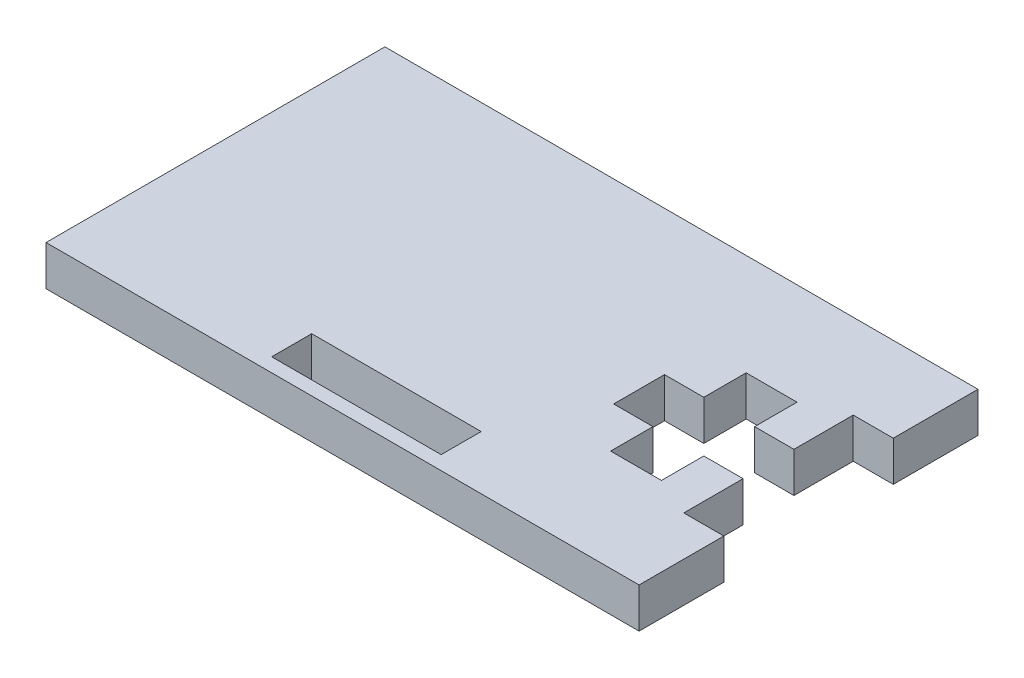
ISO-10303-21;
HEADER;
FILE_DESCRIPTION(('STEP AP214'),'2;1');
FILE_NAME('part.step','',(''),(''),'','','');
FILE_SCHEMA(('AUTOMOTIVE_DESIGN { 1 0 10303 214 1 1 1 1 }'));
ENDSEC;
DATA;
#1=APPLICATION_CONTEXT('core data for automotive mechanical design processes');
#2=APPLICATION_PROTOCOL_DEFINITION('international standard','automotive_design',2000,#1);
#3=PRODUCT_CONTEXT('',#1,'mechanical');
#4=PRODUCT('Part','Part','',(#3));
#5=PRODUCT_RELATED_PRODUCT_CATEGORY('part','',(#4));
#6=PRODUCT_DEFINITION_FORMATION('','',#4);
#7=PRODUCT_DEFINITION_CONTEXT('part definition',#1,'design');
#8=PRODUCT_DEFINITION('design','',#6,#7);
#9=PRODUCT_DEFINITION_SHAPE('','',#8);
#10=(LENGTH_UNIT() NAMED_UNIT(*) SI_UNIT(.MILLI.,.METRE.));
#11=(NAMED_UNIT(*) PLANE_ANGLE_UNIT() SI_UNIT($,.RADIAN.));
#12=(NAMED_UNIT(*) SI_UNIT($,.STERADIAN.) SOLID_ANGLE_UNIT());
#13=UNCERTAINTY_MEASURE_WITH_UNIT(LENGTH_MEASURE(1.E-05),#10,'distance_accuracy_value','');
#14=(GEOMETRIC_REPRESENTATION_CONTEXT(3) GLOBAL_UNCERTAINTY_ASSIGNED_CONTEXT((#13)) GLOBAL_UNIT_ASSIGNED_CONTEXT((#10,
#11,#12)) REPRESENTATION_CONTEXT('',''));
#15=CARTESIAN_POINT('',(0.,0.,0.));
#16=DIRECTION('',(0.,0.,1.));
#17=DIRECTION('',(1.,0.,0.));
#18=AXIS2_PLACEMENT_3D('',#15,#16,#17);
#19=CARTESIAN_POINT('',(-22.225,3.,12.7));
#20=DIRECTION('',(1.,0.,0.));
#21=DIRECTION('',(0.,0.,-1.));
#22=AXIS2_PLACEMENT_3D('',#19,#20,#21);
#23=PLANE('',#22);
#24=DIRECTION('',(0.,0.,1.));
#25=VECTOR('',#24,1.);
#26=CARTESIAN_POINT('',(-22.225,0.,12.7));
#27=LINE('',#26,#25);
#28=CARTESIAN_POINT('',(-22.225,0.,-12.7));
#29=VERTEX_POINT('',#28);
#30=CARTESIAN_POINT('',(-22.225,0.,12.7));
#31=VERTEX_POINT('',#30);
#32=EDGE_CURVE('E228',#29,#31,#27,.T.);
#33=ORIENTED_EDGE('',*,*,#32,.T.);
#34=DIRECTION('',(0.,-1.,0.));
#35=VECTOR('',#34,1.);
#36=CARTESIAN_POINT('',(-22.225,3.,12.7));
#37=LINE('',#36,#35);
#38=CARTESIAN_POINT('',(-22.225,3.,12.7));
#39=VERTEX_POINT('',#38);
#40=EDGE_CURVE('E11',#39,#31,#37,.T.);
#41=ORIENTED_EDGE('',*,*,#40,.F.);
#42=DIRECTION('',(0.,0.,1.));
#43=VECTOR('',#42,1.);
#44=CARTESIAN_POINT('',(-22.225,3.,12.7));
#45=LINE('',#44,#43);
#46=CARTESIAN_POINT('',(-22.225,3.,-12.7));
#47=VERTEX_POINT('',#46);
#48=EDGE_CURVE('E232',#47,#39,#45,.T.);
#49=ORIENTED_EDGE('',*,*,#48,.F.);
#50=DIRECTION('',(0.,-1.,0.));
#51=VECTOR('',#50,1.);
#52=CARTESIAN_POINT('',(-22.225,3.,-12.7));
#53=LINE('',#52,#51);
#54=EDGE_CURVE('E274',#47,#29,#53,.T.);
#55=ORIENTED_EDGE('',*,*,#54,.T.);
#56=EDGE_LOOP('',(#33,#41,#49,#55));
#57=FACE_BOUND('',#56,.T.);
#58=ADVANCED_FACE('F35',(#57),#23,.F.);
#59=CARTESIAN_POINT('',(22.225,3.,12.7));
#60=DIRECTION('',(0.,0.,-1.));
#61=DIRECTION('',(-1.,0.,0.));
#62=AXIS2_PLACEMENT_3D('',#59,#60,#61);
#63=PLANE('',#62);
#64=DIRECTION('',(1.,0.,0.));
#65=VECTOR('',#64,1.);
#66=CARTESIAN_POINT('',(22.225,0.,12.7));
#67=LINE('',#66,#65);
#68=CARTESIAN_POINT('',(22.225,0.,12.7));
#69=VERTEX_POINT('',#68);
#70=EDGE_CURVE('E277',#31,#69,#67,.T.);
#71=ORIENTED_EDGE('',*,*,#70,.T.);
#72=DIRECTION('',(0.,-1.,0.));
#73=VECTOR('',#72,1.);
#74=CARTESIAN_POINT('',(22.225,3.,12.7));
#75=LINE('',#74,#73);
#76=CARTESIAN_POINT('',(22.225,3.,12.7));
#77=VERTEX_POINT('',#76);
#78=EDGE_CURVE('E42',#77,#69,#75,.T.);
#79=ORIENTED_EDGE('',*,*,#78,.F.);
#80=DIRECTION('',(1.,0.,0.));
#81=VECTOR('',#80,1.);
#82=CARTESIAN_POINT('',(22.225,3.,12.7));
#83=LINE('',#82,#81);
#84=EDGE_CURVE('E235',#39,#77,#83,.T.);
#85=ORIENTED_EDGE('',*,*,#84,.F.);
#86=ORIENTED_EDGE('',*,*,#40,.T.);
#87=EDGE_LOOP('',(#71,#79,#85,#86));
#88=FACE_BOUND('',#87,.T.);
#89=ADVANCED_FACE('F392',(#88),#63,.F.);
#90=CARTESIAN_POINT('',(22.225,3.,12.7));
#91=DIRECTION('',(-1.,0.,0.));
#92=DIRECTION('',(0.,0.,1.));
#93=AXIS2_PLACEMENT_3D('',#90,#91,#92);
#94=PLANE('',#93);
#95=DIRECTION('',(0.,0.,-1.));
#96=VECTOR('',#95,1.);
#97=CARTESIAN_POINT('',(22.225,0.,12.7));
#98=LINE('',#97,#96);
#99=CARTESIAN_POINT('',(22.225,0.,6.35));
#100=VERTEX_POINT('',#99);
#101=EDGE_CURVE('E279',#69,#100,#98,.T.);
#102=ORIENTED_EDGE('',*,*,#101,.T.);
#103=DIRECTION('',(0.,-1.,0.));
#104=VECTOR('',#103,1.);
#105=CARTESIAN_POINT('',(22.225,3.,6.35));
#106=LINE('',#105,#104);
#107=CARTESIAN_POINT('',(22.225,3.,6.35));
#108=VERTEX_POINT('',#107);
#109=EDGE_CURVE('E364',#108,#100,#106,.T.);
#110=ORIENTED_EDGE('',*,*,#109,.F.);
#111=DIRECTION('',(0.,0.,-1.));
#112=VECTOR('',#111,1.);
#113=CARTESIAN_POINT('',(22.225,3.,12.7));
#114=LINE('',#113,#112);
#115=EDGE_CURVE('E238',#77,#108,#114,.T.);
#116=ORIENTED_EDGE('',*,*,#115,.F.);
#117=ORIENTED_EDGE('',*,*,#78,.T.);
#118=EDGE_LOOP('',(#102,#110,#116,#117));
#119=FACE_BOUND('',#118,.T.);
#120=ADVANCED_FACE('F371',(#119),#94,.F.);
#121=CARTESIAN_POINT('',(19.225,3.,6.35));
#122=DIRECTION('',(0.,0.,1.));
#123=DIRECTION('',(1.,0.,0.));
#124=AXIS2_PLACEMENT_3D('',#121,#122,#123);
#125=PLANE('',#124);
#126=DIRECTION('',(-1.,0.,0.));
#127=VECTOR('',#126,1.);
#128=CARTESIAN_POINT('',(19.225,0.,6.35));
#129=LINE('',#128,#127);
#130=CARTESIAN_POINT('',(19.225,0.,6.35));
#131=VERTEX_POINT('',#130);
#132=EDGE_CURVE('E281',#100,#131,#129,.T.);
#133=ORIENTED_EDGE('',*,*,#132,.T.);
#134=DIRECTION('',(0.,-1.,0.));
#135=VECTOR('',#134,1.);
#136=CARTESIAN_POINT('',(19.225,3.,6.35));
#137=LINE('',#136,#135);
#138=CARTESIAN_POINT('',(19.225,3.,6.35));
#139=VERTEX_POINT('',#138);
#140=EDGE_CURVE('E361',#139,#131,#137,.T.);
#141=ORIENTED_EDGE('',*,*,#140,.F.);
#142=DIRECTION('',(-1.,0.,0.));
#143=VECTOR('',#142,1.);
#144=CARTESIAN_POINT('',(19.225,3.,6.35));
#145=LINE('',#144,#143);
#146=EDGE_CURVE('E240',#108,#139,#145,.T.);
#147=ORIENTED_EDGE('',*,*,#146,.F.);
#148=ORIENTED_EDGE('',*,*,#109,.T.);
#149=EDGE_LOOP('',(#133,#141,#147,#148));
#150=FACE_BOUND('',#149,.T.);
#151=ADVANCED_FACE('F380',(#150),#125,.F.);
#152=CARTESIAN_POINT('',(19.225,3.,1.905));
#153=DIRECTION('',(-1.,0.,0.));
#154=DIRECTION('',(0.,0.,1.));
#155=AXIS2_PLACEMENT_3D('',#152,#153,#154);
#156=PLANE('',#155);
#157=DIRECTION('',(0.,0.,-1.));
#158=VECTOR('',#157,1.);
#159=CARTESIAN_POINT('',(19.225,0.,1.905));
#160=LINE('',#159,#158);
#161=CARTESIAN_POINT('',(19.225,0.,1.905));
#162=VERTEX_POINT('',#161);
#163=EDGE_CURVE('E283',#131,#162,#160,.T.);
#164=ORIENTED_EDGE('',*,*,#163,.T.);
#165=DIRECTION('',(0.,-1.,0.));
#166=VECTOR('',#165,1.);
#167=CARTESIAN_POINT('',(19.225,3.,1.905));
#168=LINE('',#167,#166);
#169=CARTESIAN_POINT('',(19.225,3.,1.905));
#170=VERTEX_POINT('',#169);
#171=EDGE_CURVE('E358',#170,#162,#168,.T.);
#172=ORIENTED_EDGE('',*,*,#171,.F.);
#173=DIRECTION('',(0.,0.,-1.));
#174=VECTOR('',#173,1.);
#175=CARTESIAN_POINT('',(19.225,3.,1.905));
#176=LINE('',#175,#174);
#177=EDGE_CURVE('E242',#139,#170,#176,.T.);
#178=ORIENTED_EDGE('',*,*,#177,.F.);
#179=ORIENTED_EDGE('',*,*,#140,.T.);
#180=EDGE_LOOP('',(#164,#172,#178,#179));
#181=FACE_BOUND('',#180,.T.);
#182=ADVANCED_FACE('F384',(#181),#156,.F.);
#183=CARTESIAN_POINT('',(16.28,3.,1.905));
#184=DIRECTION('',(0.,0.,1.));
#185=DIRECTION('',(1.,0.,0.));
#186=AXIS2_PLACEMENT_3D('',#183,#184,#185);
#187=PLANE('',#186);
#188=DIRECTION('',(-1.,0.,0.));
#189=VECTOR('',#188,1.);
#190=CARTESIAN_POINT('',(16.28,0.,1.905));
#191=LINE('',#190,#189);
#192=CARTESIAN_POINT('',(16.28,0.,1.905));
#193=VERTEX_POINT('',#192);
#194=EDGE_CURVE('E285',#162,#193,#191,.T.);
#195=ORIENTED_EDGE('',*,*,#194,.T.);
#196=DIRECTION('',(0.,-1.,0.));
#197=VECTOR('',#196,1.);
#198=CARTESIAN_POINT('',(16.28,3.,1.905));
#199=LINE('',#198,#197);
#200=CARTESIAN_POINT('',(16.28,3.,1.905));
#201=VERTEX_POINT('',#200);
#202=EDGE_CURVE('E355',#201,#193,#199,.T.);
#203=ORIENTED_EDGE('',*,*,#202,.F.);
#204=DIRECTION('',(-1.,0.,0.));
#205=VECTOR('',#204,1.);
#206=CARTESIAN_POINT('',(16.28,3.,1.905));
#207=LINE('',#206,#205);
#208=EDGE_CURVE('E244',#170,#201,#207,.T.);
#209=ORIENTED_EDGE('',*,*,#208,.F.);
#210=ORIENTED_EDGE('',*,*,#171,.T.);
#211=EDGE_LOOP('',(#195,#203,#209,#210));
#212=FACE_BOUND('',#211,.T.);
#213=ADVANCED_FACE('F465',(#212),#187,.F.);
#214=CARTESIAN_POINT('',(16.28,3.,5.08));
#215=DIRECTION('',(1.,0.,0.));
#216=DIRECTION('',(0.,0.,-1.));
#217=AXIS2_PLACEMENT_3D('',#214,#215,#216);
#218=PLANE('',#217);
#219=DIRECTION('',(0.,0.,1.));
#220=VECTOR('',#219,1.);
#221=CARTESIAN_POINT('',(16.28,0.,5.08));
#222=LINE('',#221,#220);
#223=CARTESIAN_POINT('',(16.28,0.,5.08));
#224=VERTEX_POINT('',#223);
#225=EDGE_CURVE('E287',#193,#224,#222,.T.);
#226=ORIENTED_EDGE('',*,*,#225,.T.);
#227=DIRECTION('',(0.,-1.,0.));
#228=VECTOR('',#227,1.);
#229=CARTESIAN_POINT('',(16.28,3.,5.08));
#230=LINE('',#229,#228);
#231=CARTESIAN_POINT('',(16.28,3.,5.08));
#232=VERTEX_POINT('',#231);
#233=EDGE_CURVE('E352',#232,#224,#230,.T.);
#234=ORIENTED_EDGE('',*,*,#233,.F.);
#235=DIRECTION('',(0.,0.,1.));
#236=VECTOR('',#235,1.);
#237=CARTESIAN_POINT('',(16.28,3.,5.08));
#238=LINE('',#237,#236);
#239=EDGE_CURVE('E246',#201,#232,#238,.T.);
#240=ORIENTED_EDGE('',*,*,#239,.F.);
#241=ORIENTED_EDGE('',*,*,#202,.T.);
#242=EDGE_LOOP('',(#226,#234,#240,#241));
#243=FACE_BOUND('',#242,.T.);
#244=ADVANCED_FACE('F463',(#243),#218,.F.);
#245=CARTESIAN_POINT('',(16.28,3.,5.08));
#246=DIRECTION('',(0.,0.,1.));
#247=DIRECTION('',(1.,0.,0.));
#248=AXIS2_PLACEMENT_3D('',#245,#246,#247);
#249=PLANE('',#248);
#250=DIRECTION('',(-1.,0.,0.));
#251=VECTOR('',#250,1.);
#252=CARTESIAN_POINT('',(16.28,0.,5.08));
#253=LINE('',#252,#251);
#254=CARTESIAN_POINT('',(12.47,0.,5.08));
#255=VERTEX_POINT('',#254);
#256=EDGE_CURVE('E289',#224,#255,#253,.T.);
#257=ORIENTED_EDGE('',*,*,#256,.T.);
#258=DIRECTION('',(0.,-1.,0.));
#259=VECTOR('',#258,1.);
#260=CARTESIAN_POINT('',(12.47,3.,5.08));
#261=LINE('',#260,#259);
#262=CARTESIAN_POINT('',(12.47,3.,5.08));
#263=VERTEX_POINT('',#262);
#264=EDGE_CURVE('E349',#263,#255,#261,.T.);
#265=ORIENTED_EDGE('',*,*,#264,.F.);
#266=DIRECTION('',(-1.,0.,0.));
#267=VECTOR('',#266,1.);
#268=CARTESIAN_POINT('',(16.28,3.,5.08));
#269=LINE('',#268,#267);
#270=EDGE_CURVE('E248',#232,#263,#269,.T.);
#271=ORIENTED_EDGE('',*,*,#270,.F.);
#272=ORIENTED_EDGE('',*,*,#233,.T.);
#273=EDGE_LOOP('',(#257,#265,#271,#272));
#274=FACE_BOUND('',#273,.T.);
#275=ADVANCED_FACE('F458',(#274),#249,.F.);
#276=CARTESIAN_POINT('',(12.47,3.,5.08));
#277=DIRECTION('',(-1.,0.,0.));
#278=DIRECTION('',(0.,0.,1.));
#279=AXIS2_PLACEMENT_3D('',#276,#277,#278);
#280=PLANE('',#279);
#281=DIRECTION('',(0.,0.,-1.));
#282=VECTOR('',#281,1.);
#283=CARTESIAN_POINT('',(12.47,0.,5.08));
#284=LINE('',#283,#282);
#285=CARTESIAN_POINT('',(12.47,0.,1.905));
#286=VERTEX_POINT('',#285);
#287=EDGE_CURVE('E291',#255,#286,#284,.T.);
#288=ORIENTED_EDGE('',*,*,#287,.T.);
#289=DIRECTION('',(0.,-1.,0.));
#290=VECTOR('',#289,1.);
#291=CARTESIAN_POINT('',(12.47,3.,1.905));
#292=LINE('',#291,#290);
#293=CARTESIAN_POINT('',(12.47,3.,1.905));
#294=VERTEX_POINT('',#293);
#295=EDGE_CURVE('E346',#294,#286,#292,.T.);
#296=ORIENTED_EDGE('',*,*,#295,.F.);
#297=DIRECTION('',(0.,0.,-1.));
#298=VECTOR('',#297,1.);
#299=CARTESIAN_POINT('',(12.47,3.,5.08));
#300=LINE('',#299,#298);
#301=EDGE_CURVE('E250',#263,#294,#300,.T.);
#302=ORIENTED_EDGE('',*,*,#301,.F.);
#303=ORIENTED_EDGE('',*,*,#264,.T.);
#304=EDGE_LOOP('',(#288,#296,#302,#303));
#305=FACE_BOUND('',#304,.T.);
#306=ADVANCED_FACE('F453',(#305),#280,.F.);
#307=CARTESIAN_POINT('',(9.525,3.,1.905));
#308=DIRECTION('',(0.,0.,1.));
#309=DIRECTION('',(1.,0.,0.));
#310=AXIS2_PLACEMENT_3D('',#307,#308,#309);
#311=PLANE('',#310);
#312=DIRECTION('',(-1.,0.,0.));
#313=VECTOR('',#312,1.);
#314=CARTESIAN_POINT('',(9.525,0.,1.905));
#315=LINE('',#314,#313);
#316=CARTESIAN_POINT('',(9.525,0.,1.905));
#317=VERTEX_POINT('',#316);
#318=EDGE_CURVE('E293',#286,#317,#315,.T.);
#319=ORIENTED_EDGE('',*,*,#318,.T.);
#320=DIRECTION('',(0.,-1.,0.));
#321=VECTOR('',#320,1.);
#322=CARTESIAN_POINT('',(9.525,3.,1.905));
#323=LINE('',#322,#321);
#324=CARTESIAN_POINT('',(9.525,3.,1.905));
#325=VERTEX_POINT('',#324);
#326=EDGE_CURVE('E343',#325,#317,#323,.T.);
#327=ORIENTED_EDGE('',*,*,#326,.F.);
#328=DIRECTION('',(-1.,0.,0.));
#329=VECTOR('',#328,1.);
#330=CARTESIAN_POINT('',(9.525,3.,1.905));
#331=LINE('',#330,#329);
#332=EDGE_CURVE('E252',#294,#325,#331,.T.);
#333=ORIENTED_EDGE('',*,*,#332,.F.);
#334=ORIENTED_EDGE('',*,*,#295,.T.);
#335=EDGE_LOOP('',(#319,#327,#333,#334));
#336=FACE_BOUND('',#335,.T.);
#337=ADVANCED_FACE('F449',(#336),#311,.F.);
#338=CARTESIAN_POINT('',(9.525,3.,-1.905));
#339=DIRECTION('',(-1.,0.,0.));
#340=DIRECTION('',(0.,0.,1.));
#341=AXIS2_PLACEMENT_3D('',#338,#339,#340);
#342=PLANE('',#341);
#343=DIRECTION('',(0.,0.,-1.));
#344=VECTOR('',#343,1.);
#345=CARTESIAN_POINT('',(9.525,0.,-1.905));
#346=LINE('',#345,#344);
#347=CARTESIAN_POINT('',(9.525,0.,-1.905));
#348=VERTEX_POINT('',#347);
#349=EDGE_CURVE('E295',#317,#348,#346,.T.);
#350=ORIENTED_EDGE('',*,*,#349,.T.);
#351=DIRECTION('',(0.,-1.,0.));
#352=VECTOR('',#351,1.);
#353=CARTESIAN_POINT('',(9.525,3.,-1.905));
#354=LINE('',#353,#352);
#355=CARTESIAN_POINT('',(9.525,3.,-1.905));
#356=VERTEX_POINT('',#355);
#357=EDGE_CURVE('E340',#356,#348,#354,.T.);
#358=ORIENTED_EDGE('',*,*,#357,.F.);
#359=DIRECTION('',(0.,0.,-1.));
#360=VECTOR('',#359,1.);
#361=CARTESIAN_POINT('',(9.525,3.,-1.905));
#362=LINE('',#361,#360);
#363=EDGE_CURVE('E254',#325,#356,#362,.T.);
#364=ORIENTED_EDGE('',*,*,#363,.F.);
#365=ORIENTED_EDGE('',*,*,#326,.T.);
#366=EDGE_LOOP('',(#350,#358,#364,#365));
#367=FACE_BOUND('',#366,.T.);
#368=ADVANCED_FACE('F444',(#367),#342,.F.);
#369=CARTESIAN_POINT('',(9.525,3.,-1.905));
#370=DIRECTION('',(0.,0.,-1.));
#371=DIRECTION('',(-1.,0.,0.));
#372=AXIS2_PLACEMENT_3D('',#369,#370,#371);
#373=PLANE('',#372);
#374=DIRECTION('',(1.,0.,0.));
#375=VECTOR('',#374,1.);
#376=CARTESIAN_POINT('',(9.525,0.,-1.905));
#377=LINE('',#376,#375);
#378=CARTESIAN_POINT('',(12.47,0.,-1.905));
#379=VERTEX_POINT('',#378);
#380=EDGE_CURVE('E297',#348,#379,#377,.T.);
#381=ORIENTED_EDGE('',*,*,#380,.T.);
#382=DIRECTION('',(0.,-1.,0.));
#383=VECTOR('',#382,1.);
#384=CARTESIAN_POINT('',(12.47,3.,-1.905));
#385=LINE('',#384,#383);
#386=CARTESIAN_POINT('',(12.47,3.,-1.905));
#387=VERTEX_POINT('',#386);
#388=EDGE_CURVE('E337',#387,#379,#385,.T.);
#389=ORIENTED_EDGE('',*,*,#388,.F.);
#390=DIRECTION('',(1.,0.,0.));
#391=VECTOR('',#390,1.);
#392=CARTESIAN_POINT('',(9.525,3.,-1.905));
#393=LINE('',#392,#391);
#394=EDGE_CURVE('E256',#356,#387,#393,.T.);
#395=ORIENTED_EDGE('',*,*,#394,.F.);
#396=ORIENTED_EDGE('',*,*,#357,.T.);
#397=EDGE_LOOP('',(#381,#389,#395,#396));
#398=FACE_BOUND('',#397,.T.);
#399=ADVANCED_FACE('F438',(#398),#373,.F.);
#400=CARTESIAN_POINT('',(12.47,3.,-1.905));
#401=DIRECTION('',(-1.,0.,0.));
#402=DIRECTION('',(0.,0.,1.));
#403=AXIS2_PLACEMENT_3D('',#400,#401,#402);
#404=PLANE('',#403);
#405=DIRECTION('',(0.,0.,-1.));
#406=VECTOR('',#405,1.);
#407=CARTESIAN_POINT('',(12.47,0.,-1.905));
#408=LINE('',#407,#406);
#409=CARTESIAN_POINT('',(12.47,0.,-5.08));
#410=VERTEX_POINT('',#409);
#411=EDGE_CURVE('E299',#379,#410,#408,.T.);
#412=ORIENTED_EDGE('',*,*,#411,.T.);
#413=DIRECTION('',(0.,-1.,0.));
#414=VECTOR('',#413,1.);
#415=CARTESIAN_POINT('',(12.47,3.,-5.08));
#416=LINE('',#415,#414);
#417=CARTESIAN_POINT('',(12.47,3.,-5.08));
#418=VERTEX_POINT('',#417);
#419=EDGE_CURVE('E334',#418,#410,#416,.T.);
#420=ORIENTED_EDGE('',*,*,#419,.F.);
#421=DIRECTION('',(0.,0.,-1.));
#422=VECTOR('',#421,1.);
#423=CARTESIAN_POINT('',(12.47,3.,-1.905));
#424=LINE('',#423,#422);
#425=EDGE_CURVE('E258',#387,#418,#424,.T.);
#426=ORIENTED_EDGE('',*,*,#425,.F.);
#427=ORIENTED_EDGE('',*,*,#388,.T.);
#428=EDGE_LOOP('',(#412,#420,#426,#427));
#429=FACE_BOUND('',#428,.T.);
#430=ADVANCED_FACE('F434',(#429),#404,.F.);
#431=CARTESIAN_POINT('',(16.28,3.,-5.08));
#432=DIRECTION('',(0.,0.,-1.));
#433=DIRECTION('',(-1.,0.,0.));
#434=AXIS2_PLACEMENT_3D('',#431,#432,#433);
#435=PLANE('',#434);
#436=DIRECTION('',(1.,0.,0.));
#437=VECTOR('',#436,1.);
#438=CARTESIAN_POINT('',(16.28,0.,-5.08));
#439=LINE('',#438,#437);
#440=CARTESIAN_POINT('',(16.28,0.,-5.08));
#441=VERTEX_POINT('',#440);
#442=EDGE_CURVE('E301',#410,#441,#439,.T.);
#443=ORIENTED_EDGE('',*,*,#442,.T.);
#444=DIRECTION('',(0.,-1.,0.));
#445=VECTOR('',#444,1.);
#446=CARTESIAN_POINT('',(16.28,3.,-5.08));
#447=LINE('',#446,#445);
#448=CARTESIAN_POINT('',(16.28,3.,-5.08));
#449=VERTEX_POINT('',#448);
#450=EDGE_CURVE('E331',#449,#441,#447,.T.);
#451=ORIENTED_EDGE('',*,*,#450,.F.);
#452=DIRECTION('',(1.,0.,0.));
#453=VECTOR('',#452,1.);
#454=CARTESIAN_POINT('',(16.28,3.,-5.08));
#455=LINE('',#454,#453);
#456=EDGE_CURVE('E260',#418,#449,#455,.T.);
#457=ORIENTED_EDGE('',*,*,#456,.F.);
#458=ORIENTED_EDGE('',*,*,#419,.T.);
#459=EDGE_LOOP('',(#443,#451,#457,#458));
#460=FACE_BOUND('',#459,.T.);
#461=ADVANCED_FACE('F429',(#460),#435,.F.);
#462=CARTESIAN_POINT('',(16.28,3.,-1.90500000000001));
#463=DIRECTION('',(1.,0.,0.));
#464=DIRECTION('',(0.,0.,-1.));
#465=AXIS2_PLACEMENT_3D('',#462,#463,#464);
#466=PLANE('',#465);
#467=DIRECTION('',(0.,0.,1.));
#468=VECTOR('',#467,1.);
#469=CARTESIAN_POINT('',(16.28,0.,-1.90500000000001));
#470=LINE('',#469,#468);
#471=CARTESIAN_POINT('',(16.28,0.,-1.90500000000001));
#472=VERTEX_POINT('',#471);
#473=EDGE_CURVE('E303',#441,#472,#470,.T.);
#474=ORIENTED_EDGE('',*,*,#473,.T.);
#475=DIRECTION('',(0.,-1.,0.));
#476=VECTOR('',#475,1.);
#477=CARTESIAN_POINT('',(16.28,3.,-1.90500000000001));
#478=LINE('',#477,#476);
#479=CARTESIAN_POINT('',(16.28,3.,-1.90500000000001));
#480=VERTEX_POINT('',#479);
#481=EDGE_CURVE('E328',#480,#472,#478,.T.);
#482=ORIENTED_EDGE('',*,*,#481,.F.);
#483=DIRECTION('',(0.,0.,1.));
#484=VECTOR('',#483,1.);
#485=CARTESIAN_POINT('',(16.28,3.,-1.90500000000001));
#486=LINE('',#485,#484);
#487=EDGE_CURVE('E262',#449,#480,#486,.T.);
#488=ORIENTED_EDGE('',*,*,#487,.F.);
#489=ORIENTED_EDGE('',*,*,#450,.T.);
#490=EDGE_LOOP('',(#474,#482,#488,#489));
#491=FACE_BOUND('',#490,.T.);
#492=ADVANCED_FACE('F423',(#491),#466,.F.);
#493=CARTESIAN_POINT('',(16.28,3.,-1.90500000000001));
#494=DIRECTION('',(0.,0.,-1.));
#495=DIRECTION('',(-1.,0.,0.));
#496=AXIS2_PLACEMENT_3D('',#493,#494,#495);
#497=PLANE('',#496);
#498=DIRECTION('',(1.,0.,0.));
#499=VECTOR('',#498,1.);
#500=CARTESIAN_POINT('',(16.28,0.,-1.90500000000001));
#501=LINE('',#500,#499);
#502=CARTESIAN_POINT('',(19.225,0.,-1.90500000000001));
#503=VERTEX_POINT('',#502);
#504=EDGE_CURVE('E305',#472,#503,#501,.T.);
#505=ORIENTED_EDGE('',*,*,#504,.T.);
#506=DIRECTION('',(0.,-1.,0.));
#507=VECTOR('',#506,1.);
#508=CARTESIAN_POINT('',(19.225,3.,-1.90500000000001));
#509=LINE('',#508,#507);
#510=CARTESIAN_POINT('',(19.225,3.,-1.90500000000001));
#511=VERTEX_POINT('',#510);
#512=EDGE_CURVE('E325',#511,#503,#509,.T.);
#513=ORIENTED_EDGE('',*,*,#512,.F.);
#514=DIRECTION('',(1.,0.,0.));
#515=VECTOR('',#514,1.);
#516=CARTESIAN_POINT('',(16.28,3.,-1.90500000000001));
#517=LINE('',#516,#515);
#518=EDGE_CURVE('E264',#480,#511,#517,.T.);
#519=ORIENTED_EDGE('',*,*,#518,.F.);
#520=ORIENTED_EDGE('',*,*,#481,.T.);
#521=EDGE_LOOP('',(#505,#513,#519,#520));
#522=FACE_BOUND('',#521,.T.);
#523=ADVANCED_FACE('F419',(#522),#497,.F.);
#524=CARTESIAN_POINT('',(19.225,3.,-6.35));
#525=DIRECTION('',(-1.,0.,0.));
#526=DIRECTION('',(0.,0.,1.));
#527=AXIS2_PLACEMENT_3D('',#524,#525,#526);
#528=PLANE('',#527);
#529=DIRECTION('',(0.,0.,-1.));
#530=VECTOR('',#529,1.);
#531=CARTESIAN_POINT('',(19.225,0.,-6.35));
#532=LINE('',#531,#530);
#533=CARTESIAN_POINT('',(19.225,0.,-6.35));
#534=VERTEX_POINT('',#533);
#535=EDGE_CURVE('E307',#503,#534,#532,.T.);
#536=ORIENTED_EDGE('',*,*,#535,.T.);
#537=DIRECTION('',(0.,-1.,0.));
#538=VECTOR('',#537,1.);
#539=CARTESIAN_POINT('',(19.225,3.,-6.35));
#540=LINE('',#539,#538);
#541=CARTESIAN_POINT('',(19.225,3.,-6.35));
#542=VERTEX_POINT('',#541);
#543=EDGE_CURVE('E322',#542,#534,#540,.T.);
#544=ORIENTED_EDGE('',*,*,#543,.F.);
#545=DIRECTION('',(0.,0.,-1.));
#546=VECTOR('',#545,1.);
#547=CARTESIAN_POINT('',(19.225,3.,-6.35));
#548=LINE('',#547,#546);
#549=EDGE_CURVE('E266',#511,#542,#548,.T.);
#550=ORIENTED_EDGE('',*,*,#549,.F.);
#551=ORIENTED_EDGE('',*,*,#512,.T.);
#552=EDGE_LOOP('',(#536,#544,#550,#551));
#553=FACE_BOUND('',#552,.T.);
#554=ADVANCED_FACE('F414',(#553),#528,.F.);
#555=CARTESIAN_POINT('',(22.225,3.,-6.35));
#556=DIRECTION('',(0.,0.,-1.));
#557=DIRECTION('',(-1.,0.,0.));
#558=AXIS2_PLACEMENT_3D('',#555,#556,#557);
#559=PLANE('',#558);
#560=DIRECTION('',(1.,0.,0.));
#561=VECTOR('',#560,1.);
#562=CARTESIAN_POINT('',(22.225,0.,-6.35));
#563=LINE('',#562,#561);
#564=CARTESIAN_POINT('',(22.225,0.,-6.35));
#565=VERTEX_POINT('',#564);
#566=EDGE_CURVE('E309',#534,#565,#563,.T.);
#567=ORIENTED_EDGE('',*,*,#566,.T.);
#568=DIRECTION('',(0.,-1.,0.));
#569=VECTOR('',#568,1.);
#570=CARTESIAN_POINT('',(22.225,3.,-6.35));
#571=LINE('',#570,#569);
#572=CARTESIAN_POINT('',(22.225,3.,-6.35));
#573=VERTEX_POINT('',#572);
#574=EDGE_CURVE('E319',#573,#565,#571,.T.);
#575=ORIENTED_EDGE('',*,*,#574,.F.);
#576=DIRECTION('',(1.,0.,0.));
#577=VECTOR('',#576,1.);
#578=CARTESIAN_POINT('',(22.225,3.,-6.35));
#579=LINE('',#578,#577);
#580=EDGE_CURVE('E268',#542,#573,#579,.T.);
#581=ORIENTED_EDGE('',*,*,#580,.F.);
#582=ORIENTED_EDGE('',*,*,#543,.T.);
#583=EDGE_LOOP('',(#567,#575,#581,#582));
#584=FACE_BOUND('',#583,.T.);
#585=ADVANCED_FACE('F408',(#584),#559,.F.);
#586=CARTESIAN_POINT('',(22.225,3.,-6.35));
#587=DIRECTION('',(-1.,0.,0.));
#588=DIRECTION('',(0.,0.,1.));
#589=AXIS2_PLACEMENT_3D('',#586,#587,#588);
#590=PLANE('',#589);
#591=DIRECTION('',(0.,0.,-1.));
#592=VECTOR('',#591,1.);
#593=CARTESIAN_POINT('',(22.225,0.,-6.35));
#594=LINE('',#593,#592);
#595=CARTESIAN_POINT('',(22.225,0.,-12.7));
#596=VERTEX_POINT('',#595);
#597=EDGE_CURVE('E311',#565,#596,#594,.T.);
#598=ORIENTED_EDGE('',*,*,#597,.T.);
#599=DIRECTION('',(0.,-1.,0.));
#600=VECTOR('',#599,1.);
#601=CARTESIAN_POINT('',(22.225,3.,-12.7));
#602=LINE('',#601,#600);
#603=CARTESIAN_POINT('',(22.225,3.,-12.7));
#604=VERTEX_POINT('',#603);
#605=EDGE_CURVE('E316',#604,#596,#602,.T.);
#606=ORIENTED_EDGE('',*,*,#605,.F.);
#607=DIRECTION('',(0.,0.,-1.));
#608=VECTOR('',#607,1.);
#609=CARTESIAN_POINT('',(22.225,3.,-6.35));
#610=LINE('',#609,#608);
#611=EDGE_CURVE('E270',#573,#604,#610,.T.);
#612=ORIENTED_EDGE('',*,*,#611,.F.);
#613=ORIENTED_EDGE('',*,*,#574,.T.);
#614=EDGE_LOOP('',(#598,#606,#612,#613));
#615=FACE_BOUND('',#614,.T.);
#616=ADVANCED_FACE('F404',(#615),#590,.F.);
#617=CARTESIAN_POINT('',(22.225,3.,-12.7));
#618=DIRECTION('',(0.,0.,1.));
#619=DIRECTION('',(1.,0.,0.));
#620=AXIS2_PLACEMENT_3D('',#617,#618,#619);
#621=PLANE('',#620);
#622=DIRECTION('',(-1.,0.,0.));
#623=VECTOR('',#622,1.);
#624=CARTESIAN_POINT('',(22.225,0.,-12.7));
#625=LINE('',#624,#623);
#626=EDGE_CURVE('E236',#596,#29,#625,.T.);
#627=ORIENTED_EDGE('',*,*,#626,.T.);
#628=ORIENTED_EDGE('',*,*,#54,.F.);
#629=DIRECTION('',(-1.,0.,0.));
#630=VECTOR('',#629,1.);
#631=CARTESIAN_POINT('',(22.225,3.,-12.7));
#632=LINE('',#631,#630);
#633=EDGE_CURVE('E272',#604,#47,#632,.T.);
#634=ORIENTED_EDGE('',*,*,#633,.F.);
#635=ORIENTED_EDGE('',*,*,#605,.T.);
#636=EDGE_LOOP('',(#627,#628,#634,#635));
#637=FACE_BOUND('',#636,.T.);
#638=ADVANCED_FACE('F399',(#637),#621,.F.);
#639=CARTESIAN_POINT('',(0.,3.,0.));
#640=DIRECTION('',(0.,1.,0.));
#641=DIRECTION('',(0.,0.,1.));
#642=AXIS2_PLACEMENT_3D('',#639,#640,#641);
#643=PLANE('',#642);
#644=DIRECTION('',(0.,0.,-1.));
#645=VECTOR('',#644,1.);
#646=CARTESIAN_POINT('',(6.35,3.,8.66));
#647=LINE('',#646,#645);
#648=CARTESIAN_POINT('',(6.35,3.,11.66));
#649=VERTEX_POINT('',#648);
#650=CARTESIAN_POINT('',(6.35,3.,8.66));
#651=VERTEX_POINT('',#650);
#652=EDGE_CURVE('E49',#649,#651,#647,.T.);
#653=ORIENTED_EDGE('',*,*,#652,.F.);
#654=DIRECTION('',(1.,0.,0.));
#655=VECTOR('',#654,1.);
#656=CARTESIAN_POINT('',(-6.35,3.,11.66));
#657=LINE('',#656,#655);
#658=CARTESIAN_POINT('',(-6.35,3.,11.66));
#659=VERTEX_POINT('',#658);
#660=EDGE_CURVE('E213',#659,#649,#657,.T.);
#661=ORIENTED_EDGE('',*,*,#660,.F.);
#662=DIRECTION('',(0.,0.,1.));
#663=VECTOR('',#662,1.);
#664=CARTESIAN_POINT('',(-6.35,3.,8.66));
#665=LINE('',#664,#663);
#666=CARTESIAN_POINT('',(-6.35,3.,8.66));
#667=VERTEX_POINT('',#666);
#668=EDGE_CURVE('E216',#667,#659,#665,.T.);
#669=ORIENTED_EDGE('',*,*,#668,.F.);
#670=DIRECTION('',(-1.,0.,0.));
#671=VECTOR('',#670,1.);
#672=CARTESIAN_POINT('',(-6.35,3.,8.66));
#673=LINE('',#672,#671);
#674=EDGE_CURVE('E222',#651,#667,#673,.T.);
#675=ORIENTED_EDGE('',*,*,#674,.F.);
#676=EDGE_LOOP('',(#653,#661,#669,#675));
#677=FACE_BOUND('',#676,.T.);
#678=ORIENTED_EDGE('',*,*,#48,.T.);
#679=ORIENTED_EDGE('',*,*,#84,.T.);
#680=ORIENTED_EDGE('',*,*,#115,.T.);
#681=ORIENTED_EDGE('',*,*,#146,.T.);
#682=ORIENTED_EDGE('',*,*,#177,.T.);
#683=ORIENTED_EDGE('',*,*,#208,.T.);
#684=ORIENTED_EDGE('',*,*,#239,.T.);
#685=ORIENTED_EDGE('',*,*,#270,.T.);
#686=ORIENTED_EDGE('',*,*,#301,.T.);
#687=ORIENTED_EDGE('',*,*,#332,.T.);
#688=ORIENTED_EDGE('',*,*,#363,.T.);
#689=ORIENTED_EDGE('',*,*,#394,.T.);
#690=ORIENTED_EDGE('',*,*,#425,.T.);
#691=ORIENTED_EDGE('',*,*,#456,.T.);
#692=ORIENTED_EDGE('',*,*,#487,.T.);
#693=ORIENTED_EDGE('',*,*,#518,.T.);
#694=ORIENTED_EDGE('',*,*,#549,.T.);
#695=ORIENTED_EDGE('',*,*,#580,.T.);
#696=ORIENTED_EDGE('',*,*,#611,.T.);
#697=ORIENTED_EDGE('',*,*,#633,.T.);
#698=EDGE_LOOP('',(#678,#679,#680,#681,#682,#683,#684,#685,#686,#687,#688,#689,#690,#691,#692,
#693,#694,#695,#696,#697));
#699=FACE_BOUND('',#698,.T.);
#700=ADVANCED_FACE('F388',(#677,#699),#643,.T.);
#701=CARTESIAN_POINT('',(0.,0.,0.));
#702=DIRECTION('',(0.,1.,0.));
#703=DIRECTION('',(0.,0.,1.));
#704=AXIS2_PLACEMENT_3D('',#701,#702,#703);
#705=PLANE('',#704);
#706=DIRECTION('',(1.,0.,0.));
#707=VECTOR('',#706,1.);
#708=CARTESIAN_POINT('',(-6.35,0.,11.66));
#709=LINE('',#708,#707);
#710=CARTESIAN_POINT('',(-6.35,0.,11.66));
#711=VERTEX_POINT('',#710);
#712=CARTESIAN_POINT('',(6.35,0.,11.66));
#713=VERTEX_POINT('',#712);
#714=EDGE_CURVE('E203',#711,#713,#709,.T.);
#715=ORIENTED_EDGE('',*,*,#714,.T.);
#716=DIRECTION('',(0.,0.,-1.));
#717=VECTOR('',#716,1.);
#718=CARTESIAN_POINT('',(6.35,0.,8.66));
#719=LINE('',#718,#717);
#720=CARTESIAN_POINT('',(6.35,0.,8.66));
#721=VERTEX_POINT('',#720);
#722=EDGE_CURVE('E197',#713,#721,#719,.T.);
#723=ORIENTED_EDGE('',*,*,#722,.T.);
#724=DIRECTION('',(-1.,0.,0.));
#725=VECTOR('',#724,1.);
#726=CARTESIAN_POINT('',(-6.35,0.,8.66));
#727=LINE('',#726,#725);
#728=CARTESIAN_POINT('',(-6.35,0.,8.66));
#729=VERTEX_POINT('',#728);
#730=EDGE_CURVE('E206',#721,#729,#727,.T.);
#731=ORIENTED_EDGE('',*,*,#730,.T.);
#732=DIRECTION('',(0.,0.,1.));
#733=VECTOR('',#732,1.);
#734=CARTESIAN_POINT('',(-6.35,0.,8.66));
#735=LINE('',#734,#733);
#736=EDGE_CURVE('E57',#729,#711,#735,.T.);
#737=ORIENTED_EDGE('',*,*,#736,.T.);
#738=EDGE_LOOP('',(#715,#723,#731,#737));
#739=FACE_BOUND('',#738,.T.);
#740=ORIENTED_EDGE('',*,*,#32,.F.);
#741=ORIENTED_EDGE('',*,*,#626,.F.);
#742=ORIENTED_EDGE('',*,*,#597,.F.);
#743=ORIENTED_EDGE('',*,*,#566,.F.);
#744=ORIENTED_EDGE('',*,*,#535,.F.);
#745=ORIENTED_EDGE('',*,*,#504,.F.);
#746=ORIENTED_EDGE('',*,*,#473,.F.);
#747=ORIENTED_EDGE('',*,*,#442,.F.);
#748=ORIENTED_EDGE('',*,*,#411,.F.);
#749=ORIENTED_EDGE('',*,*,#380,.F.);
#750=ORIENTED_EDGE('',*,*,#349,.F.);
#751=ORIENTED_EDGE('',*,*,#318,.F.);
#752=ORIENTED_EDGE('',*,*,#287,.F.);
#753=ORIENTED_EDGE('',*,*,#256,.F.);
#754=ORIENTED_EDGE('',*,*,#225,.F.);
#755=ORIENTED_EDGE('',*,*,#194,.F.);
#756=ORIENTED_EDGE('',*,*,#163,.F.);
#757=ORIENTED_EDGE('',*,*,#132,.F.);
#758=ORIENTED_EDGE('',*,*,#101,.F.);
#759=ORIENTED_EDGE('',*,*,#70,.F.);
#760=EDGE_LOOP('',(#740,#741,#742,#743,#744,#745,#746,#747,#748,#749,#750,#751,#752,#753,#754,
#755,#756,#757,#758,#759));
#761=FACE_BOUND('',#760,.T.);
#762=ADVANCED_FACE('F210',(#739,#761),#705,.F.);
#763=CARTESIAN_POINT('',(6.35,0.,8.66));
#764=DIRECTION('',(1.,0.,0.));
#765=DIRECTION('',(0.,0.,-1.));
#766=AXIS2_PLACEMENT_3D('',#763,#764,#765);
#767=PLANE('',#766);
#768=ORIENTED_EDGE('',*,*,#652,.T.);
#769=DIRECTION('',(0.,1.,0.));
#770=VECTOR('',#769,1.);
#771=CARTESIAN_POINT('',(6.35,0.,8.66));
#772=LINE('',#771,#770);
#773=EDGE_CURVE('E193',#721,#651,#772,.T.);
#774=ORIENTED_EDGE('',*,*,#773,.F.);
#775=ORIENTED_EDGE('',*,*,#722,.F.);
#776=DIRECTION('',(0.,1.,0.));
#777=VECTOR('',#776,1.);
#778=CARTESIAN_POINT('',(6.35,0.,11.66));
#779=LINE('',#778,#777);
#780=EDGE_CURVE('E226',#713,#649,#779,.T.);
#781=ORIENTED_EDGE('',*,*,#780,.T.);
#782=EDGE_LOOP('',(#768,#774,#775,#781));
#783=FACE_BOUND('',#782,.T.);
#784=ADVANCED_FACE('F195',(#783),#767,.F.);
#785=CARTESIAN_POINT('',(-6.35,0.,11.66));
#786=DIRECTION('',(0.,0.,1.));
#787=DIRECTION('',(1.,0.,0.));
#788=AXIS2_PLACEMENT_3D('',#785,#786,#787);
#789=PLANE('',#788);
#790=ORIENTED_EDGE('',*,*,#660,.T.);
#791=ORIENTED_EDGE('',*,*,#780,.F.);
#792=ORIENTED_EDGE('',*,*,#714,.F.);
#793=DIRECTION('',(0.,1.,0.));
#794=VECTOR('',#793,1.);
#795=CARTESIAN_POINT('',(-6.35,0.,11.66));
#796=LINE('',#795,#794);
#797=EDGE_CURVE('E229',#711,#659,#796,.T.);
#798=ORIENTED_EDGE('',*,*,#797,.T.);
#799=EDGE_LOOP('',(#790,#791,#792,#798));
#800=FACE_BOUND('',#799,.T.);
#801=ADVANCED_FACE('F632',(#800),#789,.F.);
#802=CARTESIAN_POINT('',(-6.35,0.,8.66));
#803=DIRECTION('',(-1.,0.,0.));
#804=DIRECTION('',(0.,0.,1.));
#805=AXIS2_PLACEMENT_3D('',#802,#803,#804);
#806=PLANE('',#805);
#807=ORIENTED_EDGE('',*,*,#668,.T.);
#808=ORIENTED_EDGE('',*,*,#797,.F.);
#809=ORIENTED_EDGE('',*,*,#736,.F.);
#810=DIRECTION('',(0.,1.,0.));
#811=VECTOR('',#810,1.);
#812=CARTESIAN_POINT('',(-6.35,0.,8.66));
#813=LINE('',#812,#811);
#814=EDGE_CURVE('E202',#729,#667,#813,.T.);
#815=ORIENTED_EDGE('',*,*,#814,.T.);
#816=EDGE_LOOP('',(#807,#808,#809,#815));
#817=FACE_BOUND('',#816,.T.);
#818=ADVANCED_FACE('F641',(#817),#806,.F.);
#819=CARTESIAN_POINT('',(-6.35,0.,8.66));
#820=DIRECTION('',(0.,0.,-1.));
#821=DIRECTION('',(-1.,0.,0.));
#822=AXIS2_PLACEMENT_3D('',#819,#820,#821);
#823=PLANE('',#822);
#824=ORIENTED_EDGE('',*,*,#674,.T.);
#825=ORIENTED_EDGE('',*,*,#814,.F.);
#826=ORIENTED_EDGE('',*,*,#730,.F.);
#827=ORIENTED_EDGE('',*,*,#773,.T.);
#828=EDGE_LOOP('',(#824,#825,#826,#827));
#829=FACE_BOUND('',#828,.T.);
#830=ADVANCED_FACE('F207',(#829),#823,.F.);
#831=CLOSED_SHELL('',(#58,#89,#120,#151,#182,#213,#244,#275,#306,#337,#368,#399,#430,#461,#492,
#523,#554,#585,#616,#638,#700,#762,#784,#801,#818,#830));
#832=MANIFOLD_SOLID_BREP('B2',#831);
#833=ADVANCED_BREP_SHAPE_REPRESENTATION('',(#18,#832),#14);
#834=SHAPE_DEFINITION_REPRESENTATION(#9,#833);
ENDSEC;
END-ISO-10303-21;
